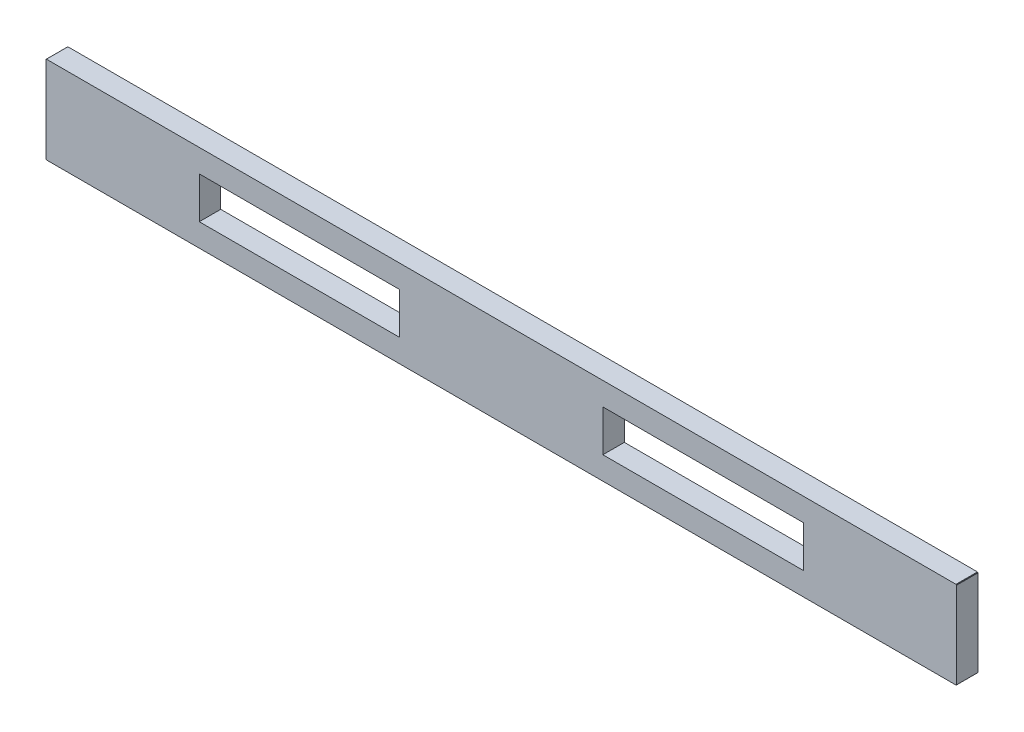
ISO-10303-21;
HEADER;
FILE_DESCRIPTION(('STEP AP214'),'2;1');
FILE_NAME('part.step','',(''),(''),'','','');
FILE_SCHEMA(('AUTOMOTIVE_DESIGN { 1 0 10303 214 1 1 1 1 }'));
ENDSEC;
DATA;
#1=APPLICATION_CONTEXT('core data for automotive mechanical design processes');
#2=APPLICATION_PROTOCOL_DEFINITION('international standard','automotive_design',2000,#1);
#3=PRODUCT_CONTEXT('',#1,'mechanical');
#4=PRODUCT('Part','Part','',(#3));
#5=PRODUCT_RELATED_PRODUCT_CATEGORY('part','',(#4));
#6=PRODUCT_DEFINITION_FORMATION('','',#4);
#7=PRODUCT_DEFINITION_CONTEXT('part definition',#1,'design');
#8=PRODUCT_DEFINITION('design','',#6,#7);
#9=PRODUCT_DEFINITION_SHAPE('','',#8);
#10=(LENGTH_UNIT() NAMED_UNIT(*) SI_UNIT(.MILLI.,.METRE.));
#11=(NAMED_UNIT(*) PLANE_ANGLE_UNIT() SI_UNIT($,.RADIAN.));
#12=(NAMED_UNIT(*) SI_UNIT($,.STERADIAN.) SOLID_ANGLE_UNIT());
#13=UNCERTAINTY_MEASURE_WITH_UNIT(LENGTH_MEASURE(1.E-05),#10,'distance_accuracy_value','');
#14=(GEOMETRIC_REPRESENTATION_CONTEXT(3) GLOBAL_UNCERTAINTY_ASSIGNED_CONTEXT((#13)) GLOBAL_UNIT_ASSIGNED_CONTEXT((#10,
#11,#12)) REPRESENTATION_CONTEXT('',''));
#15=CARTESIAN_POINT('',(0.,0.,0.));
#16=DIRECTION('',(0.,0.,1.));
#17=DIRECTION('',(1.,0.,0.));
#18=AXIS2_PLACEMENT_3D('',#15,#16,#17);
#19=CARTESIAN_POINT('',(0.,0.,3.));
#20=DIRECTION('',(0.,0.,1.));
#21=DIRECTION('',(1.,0.,0.));
#22=AXIS2_PLACEMENT_3D('',#19,#20,#21);
#23=PLANE('',#22);
#24=DIRECTION('',(1.,0.,0.));
#25=VECTOR('',#24,1.);
#26=CARTESIAN_POINT('',(421.603180615999,802.882994984314,3.));
#27=LINE('',#26,#25);
#28=CARTESIAN_POINT('',(294.526980615999,802.882994984314,3.));
#29=VERTEX_POINT('',#28);
#30=CARTESIAN_POINT('',(421.628580615999,802.882994984314,3.));
#31=VERTEX_POINT('',#30);
#32=EDGE_CURVE('E275',#29,#31,#27,.T.);
#33=ORIENTED_EDGE('',*,*,#32,.T.);
#34=DIRECTION('',(0.707106781185002,0.707106781188093,0.));
#35=VECTOR('',#34,1.);
#36=CARTESIAN_POINT('',(421.628580615999,802.882994984314,3.));
#37=LINE('',#36,#35);
#38=CARTESIAN_POINT('',(421.653980615999,802.908394984315,3.));
#39=VERTEX_POINT('',#38);
#40=EDGE_CURVE('E278',#31,#39,#37,.T.);
#41=ORIENTED_EDGE('',*,*,#40,.T.);
#42=DIRECTION('',(0.,1.,0.));
#43=VECTOR('',#42,1.);
#44=CARTESIAN_POINT('',(421.653980615999,802.908394984315,3.));
#45=LINE('',#44,#43);
#46=CARTESIAN_POINT('',(421.653980615999,802.933794984314,3.));
#47=VERTEX_POINT('',#46);
#48=EDGE_CURVE('E281',#39,#47,#45,.T.);
#49=ORIENTED_EDGE('',*,*,#48,.T.);
#50=DIRECTION('',(0.707106781181139,0.707106781191956,0.));
#51=VECTOR('',#50,1.);
#52=CARTESIAN_POINT('',(421.653980615999,802.933794984314,3.));
#53=LINE('',#52,#51);
#54=CARTESIAN_POINT('',(421.679380615999,802.959194984314,3.));
#55=VERTEX_POINT('',#54);
#56=EDGE_CURVE('E283',#47,#55,#53,.T.);
#57=ORIENTED_EDGE('',*,*,#56,.T.);
#58=DIRECTION('',(0.,1.,0.));
#59=VECTOR('',#58,1.);
#60=CARTESIAN_POINT('',(421.679380615999,802.959194984314,3.));
#61=LINE('',#60,#59);
#62=CARTESIAN_POINT('',(421.679380615999,814.998794984315,3.));
#63=VERTEX_POINT('',#62);
#64=EDGE_CURVE('E285',#55,#63,#61,.T.);
#65=ORIENTED_EDGE('',*,*,#64,.T.);
#66=DIRECTION('',(-0.70710678118732,0.707106781185775,0.));
#67=VECTOR('',#66,1.);
#68=CARTESIAN_POINT('',(421.679380615999,814.998794984315,3.));
#69=LINE('',#68,#67);
#70=CARTESIAN_POINT('',(421.653980615999,815.024194984314,3.));
#71=VERTEX_POINT('',#70);
#72=EDGE_CURVE('E287',#63,#71,#69,.T.);
#73=ORIENTED_EDGE('',*,*,#72,.T.);
#74=DIRECTION('',(0.,1.,0.));
#75=VECTOR('',#74,1.);
#76=CARTESIAN_POINT('',(421.653980615999,815.024194984314,3.));
#77=LINE('',#76,#75);
#78=CARTESIAN_POINT('',(421.653980615999,815.049594984314,3.));
#79=VERTEX_POINT('',#78);
#80=EDGE_CURVE('E289',#71,#79,#77,.T.);
#81=ORIENTED_EDGE('',*,*,#80,.T.);
#82=DIRECTION('',(-1.,0.,0.));
#83=VECTOR('',#82,1.);
#84=CARTESIAN_POINT('',(421.653980615999,815.049594984314,3.));
#85=LINE('',#84,#83);
#86=CARTESIAN_POINT('',(421.628580615999,815.049594984314,3.));
#87=VERTEX_POINT('',#86);
#88=EDGE_CURVE('E291',#79,#87,#85,.T.);
#89=ORIENTED_EDGE('',*,*,#88,.T.);
#90=DIRECTION('',(-0.707106781188093,0.707106781185002,0.));
#91=VECTOR('',#90,1.);
#92=CARTESIAN_POINT('',(421.628580615999,815.049594984314,3.));
#93=LINE('',#92,#91);
#94=CARTESIAN_POINT('',(421.603180615999,815.074994984315,3.));
#95=VERTEX_POINT('',#94);
#96=EDGE_CURVE('E293',#87,#95,#93,.T.);
#97=ORIENTED_EDGE('',*,*,#96,.T.);
#98=DIRECTION('',(-1.,0.,0.));
#99=VECTOR('',#98,1.);
#100=CARTESIAN_POINT('',(421.603180615999,815.074994984315,3.));
#101=LINE('',#100,#99);
#102=CARTESIAN_POINT('',(294.552380615999,815.074994984315,3.));
#103=VERTEX_POINT('',#102);
#104=EDGE_CURVE('E295',#95,#103,#101,.T.);
#105=ORIENTED_EDGE('',*,*,#104,.T.);
#106=DIRECTION('',(-0.707106781184229,-0.707106781188865,0.));
#107=VECTOR('',#106,1.);
#108=CARTESIAN_POINT('',(294.552380615999,815.074994984315,3.));
#109=LINE('',#108,#107);
#110=CARTESIAN_POINT('',(294.526980615999,815.049594984314,3.));
#111=VERTEX_POINT('',#110);
#112=EDGE_CURVE('E297',#103,#111,#109,.T.);
#113=ORIENTED_EDGE('',*,*,#112,.T.);
#114=DIRECTION('',(-1.,0.,0.));
#115=VECTOR('',#114,1.);
#116=CARTESIAN_POINT('',(294.526980615999,815.049594984314,3.));
#117=LINE('',#116,#115);
#118=CARTESIAN_POINT('',(294.501580615999,815.049594984314,3.));
#119=VERTEX_POINT('',#118);
#120=EDGE_CURVE('E299',#111,#119,#117,.T.);
#121=ORIENTED_EDGE('',*,*,#120,.T.);
#122=DIRECTION('',(0.,-1.,0.));
#123=VECTOR('',#122,1.);
#124=CARTESIAN_POINT('',(294.501580615999,815.049594984314,3.));
#125=LINE('',#124,#123);
#126=CARTESIAN_POINT('',(294.501580615999,815.024194984314,3.));
#127=VERTEX_POINT('',#126);
#128=EDGE_CURVE('E301',#119,#127,#125,.T.);
#129=ORIENTED_EDGE('',*,*,#128,.T.);
#130=DIRECTION('',(-0.707106781188865,-0.707106781184229,0.));
#131=VECTOR('',#130,1.);
#132=CARTESIAN_POINT('',(294.501580615999,815.024194984314,3.));
#133=LINE('',#132,#131);
#134=CARTESIAN_POINT('',(294.476180615999,814.998794984315,3.));
#135=VERTEX_POINT('',#134);
#136=EDGE_CURVE('E303',#127,#135,#133,.T.);
#137=ORIENTED_EDGE('',*,*,#136,.T.);
#138=DIRECTION('',(0.,-1.,0.));
#139=VECTOR('',#138,1.);
#140=CARTESIAN_POINT('',(294.476180615999,814.998794984315,3.));
#141=LINE('',#140,#139);
#142=CARTESIAN_POINT('',(294.476180615999,802.959194984314,3.));
#143=VERTEX_POINT('',#142);
#144=EDGE_CURVE('E305',#135,#143,#141,.T.);
#145=ORIENTED_EDGE('',*,*,#144,.T.);
#146=DIRECTION('',(0.447213595501522,-0.894427190999134,0.));
#147=VECTOR('',#146,1.);
#148=CARTESIAN_POINT('',(294.476180615999,802.959194984314,3.));
#149=LINE('',#148,#147);
#150=CARTESIAN_POINT('',(294.501580615999,802.908394984315,3.));
#151=VERTEX_POINT('',#150);
#152=EDGE_CURVE('E307',#143,#151,#149,.T.);
#153=ORIENTED_EDGE('',*,*,#152,.T.);
#154=DIRECTION('',(0.707106781180366,-0.707106781192729,0.));
#155=VECTOR('',#154,1.);
#156=CARTESIAN_POINT('',(294.501580615999,802.908394984315,3.));
#157=LINE('',#156,#155);
#158=EDGE_CURVE('E309',#151,#29,#157,.T.);
#159=ORIENTED_EDGE('',*,*,#158,.T.);
#160=EDGE_LOOP('',(#33,#41,#49,#57,#65,#73,#81,#89,#97,#105,#113,#121,#129,#137,#145,#153,#159));
#161=FACE_BOUND('',#160,.T.);
#162=DIRECTION('',(0.,1.,0.));
#163=VECTOR('',#162,1.);
#164=CARTESIAN_POINT('',(400.267180615999,806.083394984315,3.));
#165=LINE('',#164,#163);
#166=CARTESIAN_POINT('',(400.267180615999,806.083394984315,3.));
#167=VERTEX_POINT('',#166);
#168=CARTESIAN_POINT('',(400.267180615999,811.874594984315,3.));
#169=VERTEX_POINT('',#168);
#170=EDGE_CURVE('E246',#167,#169,#165,.T.);
#171=ORIENTED_EDGE('',*,*,#170,.F.);
#172=DIRECTION('',(1.,0.,0.));
#173=VECTOR('',#172,1.);
#174=CARTESIAN_POINT('',(372.276380615999,806.083394984315,3.));
#175=LINE('',#174,#173);
#176=CARTESIAN_POINT('',(372.276380615999,806.083394984315,3.));
#177=VERTEX_POINT('',#176);
#178=EDGE_CURVE('E244',#177,#167,#175,.T.);
#179=ORIENTED_EDGE('',*,*,#178,.F.);
#180=DIRECTION('',(0.,-1.,0.));
#181=VECTOR('',#180,1.);
#182=CARTESIAN_POINT('',(372.276380615999,811.874594984315,3.));
#183=LINE('',#182,#181);
#184=CARTESIAN_POINT('',(372.276380615999,811.874594984315,3.));
#185=VERTEX_POINT('',#184);
#186=EDGE_CURVE('E252',#185,#177,#183,.T.);
#187=ORIENTED_EDGE('',*,*,#186,.F.);
#188=DIRECTION('',(-1.,0.,0.));
#189=VECTOR('',#188,1.);
#190=CARTESIAN_POINT('',(400.267180615999,811.874594984315,3.));
#191=LINE('',#190,#189);
#192=EDGE_CURVE('E249',#169,#185,#191,.T.);
#193=ORIENTED_EDGE('',*,*,#192,.F.);
#194=EDGE_LOOP('',(#171,#179,#187,#193));
#195=FACE_BOUND('',#194,.T.);
#196=DIRECTION('',(0.,1.,0.));
#197=VECTOR('',#196,1.);
#198=CARTESIAN_POINT('',(343.879180615999,806.083394984315,3.));
#199=LINE('',#198,#197);
#200=CARTESIAN_POINT('',(343.879180615999,806.083394984315,3.));
#201=VERTEX_POINT('',#200);
#202=CARTESIAN_POINT('',(343.879180615999,811.874594984315,3.));
#203=VERTEX_POINT('',#202);
#204=EDGE_CURVE('E216',#201,#203,#199,.T.);
#205=ORIENTED_EDGE('',*,*,#204,.F.);
#206=DIRECTION('',(1.,0.,0.));
#207=VECTOR('',#206,1.);
#208=CARTESIAN_POINT('',(315.888380615999,806.083394984315,3.));
#209=LINE('',#208,#207);
#210=CARTESIAN_POINT('',(315.888380615999,806.083394984315,3.));
#211=VERTEX_POINT('',#210);
#212=EDGE_CURVE('E208',#211,#201,#209,.T.);
#213=ORIENTED_EDGE('',*,*,#212,.F.);
#214=DIRECTION('',(0.,-1.,0.));
#215=VECTOR('',#214,1.);
#216=CARTESIAN_POINT('',(315.888380615999,811.874594984315,3.));
#217=LINE('',#216,#215);
#218=CARTESIAN_POINT('',(315.888380615999,811.874594984315,3.));
#219=VERTEX_POINT('',#218);
#220=EDGE_CURVE('E230',#219,#211,#217,.T.);
#221=ORIENTED_EDGE('',*,*,#220,.F.);
#222=DIRECTION('',(-1.,0.,0.));
#223=VECTOR('',#222,1.);
#224=CARTESIAN_POINT('',(343.879180615999,811.874594984315,3.));
#225=LINE('',#224,#223);
#226=EDGE_CURVE('E228',#203,#219,#225,.T.);
#227=ORIENTED_EDGE('',*,*,#226,.F.);
#228=EDGE_LOOP('',(#205,#213,#221,#227));
#229=FACE_BOUND('',#228,.T.);
#230=ADVANCED_FACE('F41',(#161,#195,#229),#23,.T.);
#231=CARTESIAN_POINT('',(0.,0.,0.));
#232=DIRECTION('',(0.,0.,1.));
#233=DIRECTION('',(1.,0.,0.));
#234=AXIS2_PLACEMENT_3D('',#231,#232,#233);
#235=PLANE('',#234);
#236=DIRECTION('',(1.,0.,0.));
#237=VECTOR('',#236,1.);
#238=CARTESIAN_POINT('',(372.276380615999,806.083394984315,0.));
#239=LINE('',#238,#237);
#240=CARTESIAN_POINT('',(372.276380615999,806.083394984315,0.));
#241=VERTEX_POINT('',#240);
#242=CARTESIAN_POINT('',(400.267180615999,806.083394984315,0.));
#243=VERTEX_POINT('',#242);
#244=EDGE_CURVE('E224',#241,#243,#239,.T.);
#245=ORIENTED_EDGE('',*,*,#244,.T.);
#246=DIRECTION('',(0.,1.,0.));
#247=VECTOR('',#246,1.);
#248=CARTESIAN_POINT('',(400.267180615999,806.083394984315,0.));
#249=LINE('',#248,#247);
#250=CARTESIAN_POINT('',(400.267180615999,811.874594984315,0.));
#251=VERTEX_POINT('',#250);
#252=EDGE_CURVE('E257',#243,#251,#249,.T.);
#253=ORIENTED_EDGE('',*,*,#252,.T.);
#254=DIRECTION('',(-1.,0.,0.));
#255=VECTOR('',#254,1.);
#256=CARTESIAN_POINT('',(400.267180615999,811.874594984315,0.));
#257=LINE('',#256,#255);
#258=CARTESIAN_POINT('',(372.276380615999,811.874594984315,0.));
#259=VERTEX_POINT('',#258);
#260=EDGE_CURVE('E260',#251,#259,#257,.T.);
#261=ORIENTED_EDGE('',*,*,#260,.T.);
#262=DIRECTION('',(0.,-1.,0.));
#263=VECTOR('',#262,1.);
#264=CARTESIAN_POINT('',(372.276380615999,811.874594984315,0.));
#265=LINE('',#264,#263);
#266=EDGE_CURVE('E247',#259,#241,#265,.T.);
#267=ORIENTED_EDGE('',*,*,#266,.T.);
#268=EDGE_LOOP('',(#245,#253,#261,#267));
#269=FACE_BOUND('',#268,.T.);
#270=DIRECTION('',(0.707106781185002,0.707106781188093,0.));
#271=VECTOR('',#270,1.);
#272=CARTESIAN_POINT('',(421.628580615999,802.882994984314,0.));
#273=LINE('',#272,#271);
#274=CARTESIAN_POINT('',(421.628580615999,802.882994984314,0.));
#275=VERTEX_POINT('',#274);
#276=CARTESIAN_POINT('',(421.653980615999,802.908394984315,0.));
#277=VERTEX_POINT('',#276);
#278=EDGE_CURVE('E274',#275,#277,#273,.T.);
#279=ORIENTED_EDGE('',*,*,#278,.F.);
#280=DIRECTION('',(1.,0.,0.));
#281=VECTOR('',#280,1.);
#282=CARTESIAN_POINT('',(421.603180615999,802.882994984314,0.));
#283=LINE('',#282,#281);
#284=CARTESIAN_POINT('',(294.526980615999,802.882994984314,0.));
#285=VERTEX_POINT('',#284);
#286=EDGE_CURVE('E279',#285,#275,#283,.T.);
#287=ORIENTED_EDGE('',*,*,#286,.F.);
#288=DIRECTION('',(0.707106781180366,-0.707106781192729,0.));
#289=VECTOR('',#288,1.);
#290=CARTESIAN_POINT('',(294.501580615999,802.908394984315,0.));
#291=LINE('',#290,#289);
#292=CARTESIAN_POINT('',(294.501580615999,802.908394984315,0.));
#293=VERTEX_POINT('',#292);
#294=EDGE_CURVE('E342',#293,#285,#291,.T.);
#295=ORIENTED_EDGE('',*,*,#294,.F.);
#296=DIRECTION('',(0.447213595501522,-0.894427190999134,0.));
#297=VECTOR('',#296,1.);
#298=CARTESIAN_POINT('',(294.476180615999,802.959194984314,0.));
#299=LINE('',#298,#297);
#300=CARTESIAN_POINT('',(294.476180615999,802.959194984314,0.));
#301=VERTEX_POINT('',#300);
#302=EDGE_CURVE('E340',#301,#293,#299,.T.);
#303=ORIENTED_EDGE('',*,*,#302,.F.);
#304=DIRECTION('',(0.,-1.,0.));
#305=VECTOR('',#304,1.);
#306=CARTESIAN_POINT('',(294.476180615999,814.998794984315,0.));
#307=LINE('',#306,#305);
#308=CARTESIAN_POINT('',(294.476180615999,814.998794984315,0.));
#309=VERTEX_POINT('',#308);
#310=EDGE_CURVE('E338',#309,#301,#307,.T.);
#311=ORIENTED_EDGE('',*,*,#310,.F.);
#312=DIRECTION('',(-0.707106781188865,-0.707106781184229,0.));
#313=VECTOR('',#312,1.);
#314=CARTESIAN_POINT('',(294.501580615999,815.024194984314,0.));
#315=LINE('',#314,#313);
#316=CARTESIAN_POINT('',(294.501580615999,815.024194984314,0.));
#317=VERTEX_POINT('',#316);
#318=EDGE_CURVE('E336',#317,#309,#315,.T.);
#319=ORIENTED_EDGE('',*,*,#318,.F.);
#320=DIRECTION('',(0.,-1.,0.));
#321=VECTOR('',#320,1.);
#322=CARTESIAN_POINT('',(294.501580615999,815.049594984314,0.));
#323=LINE('',#322,#321);
#324=CARTESIAN_POINT('',(294.501580615999,815.049594984314,0.));
#325=VERTEX_POINT('',#324);
#326=EDGE_CURVE('E334',#325,#317,#323,.T.);
#327=ORIENTED_EDGE('',*,*,#326,.F.);
#328=DIRECTION('',(-1.,0.,0.));
#329=VECTOR('',#328,1.);
#330=CARTESIAN_POINT('',(294.526980615999,815.049594984314,0.));
#331=LINE('',#330,#329);
#332=CARTESIAN_POINT('',(294.526980615999,815.049594984314,0.));
#333=VERTEX_POINT('',#332);
#334=EDGE_CURVE('E332',#333,#325,#331,.T.);
#335=ORIENTED_EDGE('',*,*,#334,.F.);
#336=DIRECTION('',(-0.707106781184229,-0.707106781188865,0.));
#337=VECTOR('',#336,1.);
#338=CARTESIAN_POINT('',(294.552380615999,815.074994984315,0.));
#339=LINE('',#338,#337);
#340=CARTESIAN_POINT('',(294.552380615999,815.074994984315,0.));
#341=VERTEX_POINT('',#340);
#342=EDGE_CURVE('E330',#341,#333,#339,.T.);
#343=ORIENTED_EDGE('',*,*,#342,.F.);
#344=DIRECTION('',(-1.,0.,0.));
#345=VECTOR('',#344,1.);
#346=CARTESIAN_POINT('',(421.603180615999,815.074994984315,0.));
#347=LINE('',#346,#345);
#348=CARTESIAN_POINT('',(421.603180615999,815.074994984315,0.));
#349=VERTEX_POINT('',#348);
#350=EDGE_CURVE('E328',#349,#341,#347,.T.);
#351=ORIENTED_EDGE('',*,*,#350,.F.);
#352=DIRECTION('',(-0.707106781188093,0.707106781185002,0.));
#353=VECTOR('',#352,1.);
#354=CARTESIAN_POINT('',(421.628580615999,815.049594984314,0.));
#355=LINE('',#354,#353);
#356=CARTESIAN_POINT('',(421.628580615999,815.049594984314,0.));
#357=VERTEX_POINT('',#356);
#358=EDGE_CURVE('E326',#357,#349,#355,.T.);
#359=ORIENTED_EDGE('',*,*,#358,.F.);
#360=DIRECTION('',(-1.,0.,0.));
#361=VECTOR('',#360,1.);
#362=CARTESIAN_POINT('',(421.653980615999,815.049594984314,0.));
#363=LINE('',#362,#361);
#364=CARTESIAN_POINT('',(421.653980615999,815.049594984314,0.));
#365=VERTEX_POINT('',#364);
#366=EDGE_CURVE('E324',#365,#357,#363,.T.);
#367=ORIENTED_EDGE('',*,*,#366,.F.);
#368=DIRECTION('',(0.,1.,0.));
#369=VECTOR('',#368,1.);
#370=CARTESIAN_POINT('',(421.653980615999,815.024194984314,0.));
#371=LINE('',#370,#369);
#372=CARTESIAN_POINT('',(421.653980615999,815.024194984314,0.));
#373=VERTEX_POINT('',#372);
#374=EDGE_CURVE('E322',#373,#365,#371,.T.);
#375=ORIENTED_EDGE('',*,*,#374,.F.);
#376=DIRECTION('',(-0.70710678118732,0.707106781185775,0.));
#377=VECTOR('',#376,1.);
#378=CARTESIAN_POINT('',(421.679380615999,814.998794984315,0.));
#379=LINE('',#378,#377);
#380=CARTESIAN_POINT('',(421.679380615999,814.998794984315,0.));
#381=VERTEX_POINT('',#380);
#382=EDGE_CURVE('E320',#381,#373,#379,.T.);
#383=ORIENTED_EDGE('',*,*,#382,.F.);
#384=DIRECTION('',(0.,1.,0.));
#385=VECTOR('',#384,1.);
#386=CARTESIAN_POINT('',(421.679380615999,802.959194984314,0.));
#387=LINE('',#386,#385);
#388=CARTESIAN_POINT('',(421.679380615999,802.959194984314,0.));
#389=VERTEX_POINT('',#388);
#390=EDGE_CURVE('E318',#389,#381,#387,.T.);
#391=ORIENTED_EDGE('',*,*,#390,.F.);
#392=DIRECTION('',(0.707106781181139,0.707106781191956,0.));
#393=VECTOR('',#392,1.);
#394=CARTESIAN_POINT('',(421.653980615999,802.933794984314,0.));
#395=LINE('',#394,#393);
#396=CARTESIAN_POINT('',(421.653980615999,802.933794984314,0.));
#397=VERTEX_POINT('',#396);
#398=EDGE_CURVE('E316',#397,#389,#395,.T.);
#399=ORIENTED_EDGE('',*,*,#398,.F.);
#400=DIRECTION('',(0.,1.,0.));
#401=VECTOR('',#400,1.);
#402=CARTESIAN_POINT('',(421.653980615999,802.908394984315,0.));
#403=LINE('',#402,#401);
#404=EDGE_CURVE('E314',#277,#397,#403,.T.);
#405=ORIENTED_EDGE('',*,*,#404,.F.);
#406=EDGE_LOOP('',(#279,#287,#295,#303,#311,#319,#327,#335,#343,#351,#359,#367,#375,#383,#391,
#399,#405));
#407=FACE_BOUND('',#406,.T.);
#408=DIRECTION('',(1.,0.,0.));
#409=VECTOR('',#408,1.);
#410=CARTESIAN_POINT('',(315.888380615999,806.083394984315,0.));
#411=LINE('',#410,#409);
#412=CARTESIAN_POINT('',(315.888380615999,806.083394984315,0.));
#413=VERTEX_POINT('',#412);
#414=CARTESIAN_POINT('',(343.879180615999,806.083394984315,0.));
#415=VERTEX_POINT('',#414);
#416=EDGE_CURVE('E64',#413,#415,#411,.T.);
#417=ORIENTED_EDGE('',*,*,#416,.T.);
#418=DIRECTION('',(0.,1.,0.));
#419=VECTOR('',#418,1.);
#420=CARTESIAN_POINT('',(343.879180615999,806.083394984315,0.));
#421=LINE('',#420,#419);
#422=CARTESIAN_POINT('',(343.879180615999,811.874594984315,0.));
#423=VERTEX_POINT('',#422);
#424=EDGE_CURVE('E223',#415,#423,#421,.T.);
#425=ORIENTED_EDGE('',*,*,#424,.T.);
#426=DIRECTION('',(-1.,0.,0.));
#427=VECTOR('',#426,1.);
#428=CARTESIAN_POINT('',(343.879180615999,811.874594984315,0.));
#429=LINE('',#428,#427);
#430=CARTESIAN_POINT('',(315.888380615999,811.874594984315,0.));
#431=VERTEX_POINT('',#430);
#432=EDGE_CURVE('E236',#423,#431,#429,.T.);
#433=ORIENTED_EDGE('',*,*,#432,.T.);
#434=DIRECTION('',(0.,-1.,0.));
#435=VECTOR('',#434,1.);
#436=CARTESIAN_POINT('',(315.888380615999,811.874594984315,0.));
#437=LINE('',#436,#435);
#438=EDGE_CURVE('E217',#431,#413,#437,.T.);
#439=ORIENTED_EDGE('',*,*,#438,.T.);
#440=EDGE_LOOP('',(#417,#425,#433,#439));
#441=FACE_BOUND('',#440,.T.);
#442=ADVANCED_FACE('F400',(#269,#407,#441),#235,.F.);
#443=CARTESIAN_POINT('',(421.628580615999,802.882994984314,3.));
#444=DIRECTION('',(-0.707106781188093,0.707106781185002,0.));
#445=DIRECTION('',(-0.707106781185002,-0.707106781188093,0.));
#446=AXIS2_PLACEMENT_3D('',#443,#444,#445);
#447=PLANE('',#446);
#448=ORIENTED_EDGE('',*,*,#278,.T.);
#449=DIRECTION('',(0.,0.,-1.));
#450=VECTOR('',#449,1.);
#451=CARTESIAN_POINT('',(421.653980615999,802.908394984315,3.));
#452=LINE('',#451,#450);
#453=EDGE_CURVE('E49',#39,#277,#452,.T.);
#454=ORIENTED_EDGE('',*,*,#453,.F.);
#455=ORIENTED_EDGE('',*,*,#40,.F.);
#456=DIRECTION('',(0.,0.,-1.));
#457=VECTOR('',#456,1.);
#458=CARTESIAN_POINT('',(421.628580615999,802.882994984314,3.));
#459=LINE('',#458,#457);
#460=EDGE_CURVE('E11',#31,#275,#459,.T.);
#461=ORIENTED_EDGE('',*,*,#460,.T.);
#462=EDGE_LOOP('',(#448,#454,#455,#461));
#463=FACE_BOUND('',#462,.T.);
#464=ADVANCED_FACE('F43',(#463),#447,.F.);
#465=CARTESIAN_POINT('',(421.653980615999,802.908394984315,3.));
#466=DIRECTION('',(-1.,0.,0.));
#467=DIRECTION('',(0.,0.,1.));
#468=AXIS2_PLACEMENT_3D('',#465,#466,#467);
#469=PLANE('',#468);
#470=ORIENTED_EDGE('',*,*,#404,.T.);
#471=DIRECTION('',(0.,0.,-1.));
#472=VECTOR('',#471,1.);
#473=CARTESIAN_POINT('',(421.653980615999,802.933794984314,3.));
#474=LINE('',#473,#472);
#475=EDGE_CURVE('E387',#47,#397,#474,.T.);
#476=ORIENTED_EDGE('',*,*,#475,.F.);
#477=ORIENTED_EDGE('',*,*,#48,.F.);
#478=ORIENTED_EDGE('',*,*,#453,.T.);
#479=EDGE_LOOP('',(#470,#476,#477,#478));
#480=FACE_BOUND('',#479,.T.);
#481=ADVANCED_FACE('F394',(#480),#469,.F.);
#482=CARTESIAN_POINT('',(421.653980615999,802.933794984314,3.));
#483=DIRECTION('',(-0.707106781191956,0.707106781181139,0.));
#484=DIRECTION('',(-0.707106781181139,-0.707106781191956,0.));
#485=AXIS2_PLACEMENT_3D('',#482,#483,#484);
#486=PLANE('',#485);
#487=ORIENTED_EDGE('',*,*,#398,.T.);
#488=DIRECTION('',(0.,0.,-1.));
#489=VECTOR('',#488,1.);
#490=CARTESIAN_POINT('',(421.679380615999,802.959194984314,3.));
#491=LINE('',#490,#489);
#492=EDGE_CURVE('E384',#55,#389,#491,.T.);
#493=ORIENTED_EDGE('',*,*,#492,.F.);
#494=ORIENTED_EDGE('',*,*,#56,.F.);
#495=ORIENTED_EDGE('',*,*,#475,.T.);
#496=EDGE_LOOP('',(#487,#493,#494,#495));
#497=FACE_BOUND('',#496,.T.);
#498=ADVANCED_FACE('F406',(#497),#486,.F.);
#499=CARTESIAN_POINT('',(421.679380615999,802.959194984314,3.));
#500=DIRECTION('',(-1.,0.,0.));
#501=DIRECTION('',(0.,0.,1.));
#502=AXIS2_PLACEMENT_3D('',#499,#500,#501);
#503=PLANE('',#502);
#504=ORIENTED_EDGE('',*,*,#390,.T.);
#505=DIRECTION('',(0.,0.,-1.));
#506=VECTOR('',#505,1.);
#507=CARTESIAN_POINT('',(421.679380615999,814.998794984315,3.));
#508=LINE('',#507,#506);
#509=EDGE_CURVE('E381',#63,#381,#508,.T.);
#510=ORIENTED_EDGE('',*,*,#509,.F.);
#511=ORIENTED_EDGE('',*,*,#64,.F.);
#512=ORIENTED_EDGE('',*,*,#492,.T.);
#513=EDGE_LOOP('',(#504,#510,#511,#512));
#514=FACE_BOUND('',#513,.T.);
#515=ADVANCED_FACE('F410',(#514),#503,.F.);
#516=CARTESIAN_POINT('',(421.679380615999,814.998794984315,3.));
#517=DIRECTION('',(-0.707106781185775,-0.70710678118732,0.));
#518=DIRECTION('',(0.70710678118732,-0.707106781185775,0.));
#519=AXIS2_PLACEMENT_3D('',#516,#517,#518);
#520=PLANE('',#519);
#521=ORIENTED_EDGE('',*,*,#382,.T.);
#522=DIRECTION('',(0.,0.,-1.));
#523=VECTOR('',#522,1.);
#524=CARTESIAN_POINT('',(421.653980615999,815.024194984314,3.));
#525=LINE('',#524,#523);
#526=EDGE_CURVE('E378',#71,#373,#525,.T.);
#527=ORIENTED_EDGE('',*,*,#526,.F.);
#528=ORIENTED_EDGE('',*,*,#72,.F.);
#529=ORIENTED_EDGE('',*,*,#509,.T.);
#530=EDGE_LOOP('',(#521,#527,#528,#529));
#531=FACE_BOUND('',#530,.T.);
#532=ADVANCED_FACE('F475',(#531),#520,.F.);
#533=CARTESIAN_POINT('',(421.653980615999,815.024194984314,3.));
#534=DIRECTION('',(-1.,0.,0.));
#535=DIRECTION('',(0.,0.,1.));
#536=AXIS2_PLACEMENT_3D('',#533,#534,#535);
#537=PLANE('',#536);
#538=ORIENTED_EDGE('',*,*,#374,.T.);
#539=DIRECTION('',(0.,0.,-1.));
#540=VECTOR('',#539,1.);
#541=CARTESIAN_POINT('',(421.653980615999,815.049594984314,3.));
#542=LINE('',#541,#540);
#543=EDGE_CURVE('E375',#79,#365,#542,.T.);
#544=ORIENTED_EDGE('',*,*,#543,.F.);
#545=ORIENTED_EDGE('',*,*,#80,.F.);
#546=ORIENTED_EDGE('',*,*,#526,.T.);
#547=EDGE_LOOP('',(#538,#544,#545,#546));
#548=FACE_BOUND('',#547,.T.);
#549=ADVANCED_FACE('F473',(#548),#537,.F.);
#550=CARTESIAN_POINT('',(421.653980615999,815.049594984314,3.));
#551=DIRECTION('',(0.,-1.,0.));
#552=DIRECTION('',(0.,0.,-1.));
#553=AXIS2_PLACEMENT_3D('',#550,#551,#552);
#554=PLANE('',#553);
#555=ORIENTED_EDGE('',*,*,#366,.T.);
#556=DIRECTION('',(0.,0.,-1.));
#557=VECTOR('',#556,1.);
#558=CARTESIAN_POINT('',(421.628580615999,815.049594984314,3.));
#559=LINE('',#558,#557);
#560=EDGE_CURVE('E372',#87,#357,#559,.T.);
#561=ORIENTED_EDGE('',*,*,#560,.F.);
#562=ORIENTED_EDGE('',*,*,#88,.F.);
#563=ORIENTED_EDGE('',*,*,#543,.T.);
#564=EDGE_LOOP('',(#555,#561,#562,#563));
#565=FACE_BOUND('',#564,.T.);
#566=ADVANCED_FACE('F469',(#565),#554,.F.);
#567=CARTESIAN_POINT('',(421.628580615999,815.049594984314,3.));
#568=DIRECTION('',(-0.707106781185002,-0.707106781188093,0.));
#569=DIRECTION('',(0.707106781188093,-0.707106781185002,0.));
#570=AXIS2_PLACEMENT_3D('',#567,#568,#569);
#571=PLANE('',#570);
#572=ORIENTED_EDGE('',*,*,#358,.T.);
#573=DIRECTION('',(0.,0.,-1.));
#574=VECTOR('',#573,1.);
#575=CARTESIAN_POINT('',(421.603180615999,815.074994984315,3.));
#576=LINE('',#575,#574);
#577=EDGE_CURVE('E369',#95,#349,#576,.T.);
#578=ORIENTED_EDGE('',*,*,#577,.F.);
#579=ORIENTED_EDGE('',*,*,#96,.F.);
#580=ORIENTED_EDGE('',*,*,#560,.T.);
#581=EDGE_LOOP('',(#572,#578,#579,#580));
#582=FACE_BOUND('',#581,.T.);
#583=ADVANCED_FACE('F464',(#582),#571,.F.);
#584=CARTESIAN_POINT('',(421.603180615999,815.074994984315,3.));
#585=DIRECTION('',(0.,-1.,0.));
#586=DIRECTION('',(0.,0.,-1.));
#587=AXIS2_PLACEMENT_3D('',#584,#585,#586);
#588=PLANE('',#587);
#589=ORIENTED_EDGE('',*,*,#350,.T.);
#590=DIRECTION('',(0.,0.,-1.));
#591=VECTOR('',#590,1.);
#592=CARTESIAN_POINT('',(294.552380615999,815.074994984315,3.));
#593=LINE('',#592,#591);
#594=EDGE_CURVE('E366',#103,#341,#593,.T.);
#595=ORIENTED_EDGE('',*,*,#594,.F.);
#596=ORIENTED_EDGE('',*,*,#104,.F.);
#597=ORIENTED_EDGE('',*,*,#577,.T.);
#598=EDGE_LOOP('',(#589,#595,#596,#597));
#599=FACE_BOUND('',#598,.T.);
#600=ADVANCED_FACE('F458',(#599),#588,.F.);
#601=CARTESIAN_POINT('',(294.552380615999,815.074994984315,3.));
#602=DIRECTION('',(0.707106781188866,-0.70710678118423,0.));
#603=DIRECTION('',(0.70710678118423,0.707106781188866,0.));
#604=AXIS2_PLACEMENT_3D('',#601,#602,#603);
#605=PLANE('',#604);
#606=ORIENTED_EDGE('',*,*,#342,.T.);
#607=DIRECTION('',(0.,0.,-1.));
#608=VECTOR('',#607,1.);
#609=CARTESIAN_POINT('',(294.526980615999,815.049594984314,3.));
#610=LINE('',#609,#608);
#611=EDGE_CURVE('E363',#111,#333,#610,.T.);
#612=ORIENTED_EDGE('',*,*,#611,.F.);
#613=ORIENTED_EDGE('',*,*,#112,.F.);
#614=ORIENTED_EDGE('',*,*,#594,.T.);
#615=EDGE_LOOP('',(#606,#612,#613,#614));
#616=FACE_BOUND('',#615,.T.);
#617=ADVANCED_FACE('F454',(#616),#605,.F.);
#618=CARTESIAN_POINT('',(294.526980615999,815.049594984314,3.));
#619=DIRECTION('',(0.,-1.,0.));
#620=DIRECTION('',(0.,0.,-1.));
#621=AXIS2_PLACEMENT_3D('',#618,#619,#620);
#622=PLANE('',#621);
#623=ORIENTED_EDGE('',*,*,#334,.T.);
#624=DIRECTION('',(0.,0.,-1.));
#625=VECTOR('',#624,1.);
#626=CARTESIAN_POINT('',(294.501580615999,815.049594984314,3.));
#627=LINE('',#626,#625);
#628=EDGE_CURVE('E360',#119,#325,#627,.T.);
#629=ORIENTED_EDGE('',*,*,#628,.F.);
#630=ORIENTED_EDGE('',*,*,#120,.F.);
#631=ORIENTED_EDGE('',*,*,#611,.T.);
#632=EDGE_LOOP('',(#623,#629,#630,#631));
#633=FACE_BOUND('',#632,.T.);
#634=ADVANCED_FACE('F449',(#633),#622,.F.);
#635=CARTESIAN_POINT('',(294.501580615999,815.049594984314,3.));
#636=DIRECTION('',(1.,0.,0.));
#637=DIRECTION('',(0.,0.,-1.));
#638=AXIS2_PLACEMENT_3D('',#635,#636,#637);
#639=PLANE('',#638);
#640=ORIENTED_EDGE('',*,*,#326,.T.);
#641=DIRECTION('',(0.,0.,-1.));
#642=VECTOR('',#641,1.);
#643=CARTESIAN_POINT('',(294.501580615999,815.024194984314,3.));
#644=LINE('',#643,#642);
#645=EDGE_CURVE('E357',#127,#317,#644,.T.);
#646=ORIENTED_EDGE('',*,*,#645,.F.);
#647=ORIENTED_EDGE('',*,*,#128,.F.);
#648=ORIENTED_EDGE('',*,*,#628,.T.);
#649=EDGE_LOOP('',(#640,#646,#647,#648));
#650=FACE_BOUND('',#649,.T.);
#651=ADVANCED_FACE('F443',(#650),#639,.F.);
#652=CARTESIAN_POINT('',(294.501580615999,815.024194984314,3.));
#653=DIRECTION('',(0.70710678118423,-0.707106781188866,0.));
#654=DIRECTION('',(0.707106781188866,0.70710678118423,0.));
#655=AXIS2_PLACEMENT_3D('',#652,#653,#654);
#656=PLANE('',#655);
#657=ORIENTED_EDGE('',*,*,#318,.T.);
#658=DIRECTION('',(0.,0.,-1.));
#659=VECTOR('',#658,1.);
#660=CARTESIAN_POINT('',(294.476180615999,814.998794984315,3.));
#661=LINE('',#660,#659);
#662=EDGE_CURVE('E354',#135,#309,#661,.T.);
#663=ORIENTED_EDGE('',*,*,#662,.F.);
#664=ORIENTED_EDGE('',*,*,#136,.F.);
#665=ORIENTED_EDGE('',*,*,#645,.T.);
#666=EDGE_LOOP('',(#657,#663,#664,#665));
#667=FACE_BOUND('',#666,.T.);
#668=ADVANCED_FACE('F439',(#667),#656,.F.);
#669=CARTESIAN_POINT('',(294.476180615999,814.998794984315,3.));
#670=DIRECTION('',(1.,0.,0.));
#671=DIRECTION('',(0.,0.,-1.));
#672=AXIS2_PLACEMENT_3D('',#669,#670,#671);
#673=PLANE('',#672);
#674=ORIENTED_EDGE('',*,*,#310,.T.);
#675=DIRECTION('',(0.,0.,-1.));
#676=VECTOR('',#675,1.);
#677=CARTESIAN_POINT('',(294.476180615999,802.959194984314,3.));
#678=LINE('',#677,#676);
#679=EDGE_CURVE('E351',#143,#301,#678,.T.);
#680=ORIENTED_EDGE('',*,*,#679,.F.);
#681=ORIENTED_EDGE('',*,*,#144,.F.);
#682=ORIENTED_EDGE('',*,*,#662,.T.);
#683=EDGE_LOOP('',(#674,#680,#681,#682));
#684=FACE_BOUND('',#683,.T.);
#685=ADVANCED_FACE('F434',(#684),#673,.F.);
#686=CARTESIAN_POINT('',(294.476180615999,802.959194984314,3.));
#687=DIRECTION('',(0.894427190999134,0.447213595501522,0.));
#688=DIRECTION('',(-0.447213595501522,0.894427190999134,0.));
#689=AXIS2_PLACEMENT_3D('',#686,#687,#688);
#690=PLANE('',#689);
#691=ORIENTED_EDGE('',*,*,#302,.T.);
#692=DIRECTION('',(0.,0.,-1.));
#693=VECTOR('',#692,1.);
#694=CARTESIAN_POINT('',(294.501580615999,802.908394984315,3.));
#695=LINE('',#694,#693);
#696=EDGE_CURVE('E348',#151,#293,#695,.T.);
#697=ORIENTED_EDGE('',*,*,#696,.F.);
#698=ORIENTED_EDGE('',*,*,#152,.F.);
#699=ORIENTED_EDGE('',*,*,#679,.T.);
#700=EDGE_LOOP('',(#691,#697,#698,#699));
#701=FACE_BOUND('',#700,.T.);
#702=ADVANCED_FACE('F428',(#701),#690,.F.);
#703=CARTESIAN_POINT('',(294.501580615999,802.908394984315,3.));
#704=DIRECTION('',(0.707106781192729,0.707106781180366,0.));
#705=DIRECTION('',(-0.707106781180366,0.707106781192729,0.));
#706=AXIS2_PLACEMENT_3D('',#703,#704,#705);
#707=PLANE('',#706);
#708=ORIENTED_EDGE('',*,*,#294,.T.);
#709=DIRECTION('',(0.,0.,-1.));
#710=VECTOR('',#709,1.);
#711=CARTESIAN_POINT('',(294.526980615999,802.882994984314,3.));
#712=LINE('',#711,#710);
#713=EDGE_CURVE('E312',#29,#285,#712,.T.);
#714=ORIENTED_EDGE('',*,*,#713,.F.);
#715=ORIENTED_EDGE('',*,*,#158,.F.);
#716=ORIENTED_EDGE('',*,*,#696,.T.);
#717=EDGE_LOOP('',(#708,#714,#715,#716));
#718=FACE_BOUND('',#717,.T.);
#719=ADVANCED_FACE('F423',(#718),#707,.F.);
#720=CARTESIAN_POINT('',(421.603180615999,802.882994984314,3.));
#721=DIRECTION('',(0.,1.,0.));
#722=DIRECTION('',(0.,0.,1.));
#723=AXIS2_PLACEMENT_3D('',#720,#721,#722);
#724=PLANE('',#723);
#725=ORIENTED_EDGE('',*,*,#286,.T.);
#726=ORIENTED_EDGE('',*,*,#460,.F.);
#727=ORIENTED_EDGE('',*,*,#32,.F.);
#728=ORIENTED_EDGE('',*,*,#713,.T.);
#729=EDGE_LOOP('',(#725,#726,#727,#728));
#730=FACE_BOUND('',#729,.T.);
#731=ADVANCED_FACE('F418',(#730),#724,.F.);
#732=CARTESIAN_POINT('',(372.276380615999,806.083394984315,3.));
#733=DIRECTION('',(0.,1.,0.));
#734=DIRECTION('',(0.,0.,1.));
#735=AXIS2_PLACEMENT_3D('',#732,#733,#734);
#736=PLANE('',#735);
#737=ORIENTED_EDGE('',*,*,#244,.F.);
#738=DIRECTION('',(0.,0.,-1.));
#739=VECTOR('',#738,1.);
#740=CARTESIAN_POINT('',(372.276380615999,806.083394984315,3.));
#741=LINE('',#740,#739);
#742=EDGE_CURVE('E254',#177,#241,#741,.T.);
#743=ORIENTED_EDGE('',*,*,#742,.F.);
#744=ORIENTED_EDGE('',*,*,#178,.T.);
#745=DIRECTION('',(0.,0.,-1.));
#746=VECTOR('',#745,1.);
#747=CARTESIAN_POINT('',(400.267180615999,806.083394984315,3.));
#748=LINE('',#747,#746);
#749=EDGE_CURVE('E271',#167,#243,#748,.T.);
#750=ORIENTED_EDGE('',*,*,#749,.T.);
#751=EDGE_LOOP('',(#737,#743,#744,#750));
#752=FACE_BOUND('',#751,.T.);
#753=ADVANCED_FACE('F494',(#752),#736,.T.);
#754=CARTESIAN_POINT('',(400.267180615999,806.083394984315,3.));
#755=DIRECTION('',(-1.,0.,0.));
#756=DIRECTION('',(0.,0.,1.));
#757=AXIS2_PLACEMENT_3D('',#754,#755,#756);
#758=PLANE('',#757);
#759=ORIENTED_EDGE('',*,*,#252,.F.);
#760=ORIENTED_EDGE('',*,*,#749,.F.);
#761=ORIENTED_EDGE('',*,*,#170,.T.);
#762=DIRECTION('',(0.,0.,-1.));
#763=VECTOR('',#762,1.);
#764=CARTESIAN_POINT('',(400.267180615999,811.874594984315,3.));
#765=LINE('',#764,#763);
#766=EDGE_CURVE('E269',#169,#251,#765,.T.);
#767=ORIENTED_EDGE('',*,*,#766,.T.);
#768=EDGE_LOOP('',(#759,#760,#761,#767));
#769=FACE_BOUND('',#768,.T.);
#770=ADVANCED_FACE('F588',(#769),#758,.T.);
#771=CARTESIAN_POINT('',(400.267180615999,811.874594984315,3.));
#772=DIRECTION('',(0.,-1.,0.));
#773=DIRECTION('',(0.,0.,-1.));
#774=AXIS2_PLACEMENT_3D('',#771,#772,#773);
#775=PLANE('',#774);
#776=ORIENTED_EDGE('',*,*,#260,.F.);
#777=ORIENTED_EDGE('',*,*,#766,.F.);
#778=ORIENTED_EDGE('',*,*,#192,.T.);
#779=DIRECTION('',(0.,0.,-1.));
#780=VECTOR('',#779,1.);
#781=CARTESIAN_POINT('',(372.276380615999,811.874594984315,3.));
#782=LINE('',#781,#780);
#783=EDGE_CURVE('E267',#185,#259,#782,.T.);
#784=ORIENTED_EDGE('',*,*,#783,.T.);
#785=EDGE_LOOP('',(#776,#777,#778,#784));
#786=FACE_BOUND('',#785,.T.);
#787=ADVANCED_FACE('F596',(#786),#775,.T.);
#788=CARTESIAN_POINT('',(372.276380615999,811.874594984315,3.));
#789=DIRECTION('',(1.,0.,0.));
#790=DIRECTION('',(0.,0.,-1.));
#791=AXIS2_PLACEMENT_3D('',#788,#789,#790);
#792=PLANE('',#791);
#793=ORIENTED_EDGE('',*,*,#266,.F.);
#794=ORIENTED_EDGE('',*,*,#783,.F.);
#795=ORIENTED_EDGE('',*,*,#186,.T.);
#796=ORIENTED_EDGE('',*,*,#742,.T.);
#797=EDGE_LOOP('',(#793,#794,#795,#796));
#798=FACE_BOUND('',#797,.T.);
#799=ADVANCED_FACE('F604',(#798),#792,.T.);
#800=CARTESIAN_POINT('',(315.888380615999,806.083394984315,3.));
#801=DIRECTION('',(0.,1.,0.));
#802=DIRECTION('',(0.,0.,1.));
#803=AXIS2_PLACEMENT_3D('',#800,#801,#802);
#804=PLANE('',#803);
#805=ORIENTED_EDGE('',*,*,#416,.F.);
#806=DIRECTION('',(0.,0.,-1.));
#807=VECTOR('',#806,1.);
#808=CARTESIAN_POINT('',(315.888380615999,806.083394984315,3.));
#809=LINE('',#808,#807);
#810=EDGE_CURVE('E212',#211,#413,#809,.T.);
#811=ORIENTED_EDGE('',*,*,#810,.F.);
#812=ORIENTED_EDGE('',*,*,#212,.T.);
#813=DIRECTION('',(0.,0.,-1.));
#814=VECTOR('',#813,1.);
#815=CARTESIAN_POINT('',(343.879180615999,806.083394984315,3.));
#816=LINE('',#815,#814);
#817=EDGE_CURVE('E211',#201,#415,#816,.T.);
#818=ORIENTED_EDGE('',*,*,#817,.T.);
#819=EDGE_LOOP('',(#805,#811,#812,#818));
#820=FACE_BOUND('',#819,.T.);
#821=ADVANCED_FACE('F210',(#820),#804,.T.);
#822=CARTESIAN_POINT('',(343.879180615999,806.083394984315,3.));
#823=DIRECTION('',(-1.,0.,0.));
#824=DIRECTION('',(0.,0.,1.));
#825=AXIS2_PLACEMENT_3D('',#822,#823,#824);
#826=PLANE('',#825);
#827=ORIENTED_EDGE('',*,*,#424,.F.);
#828=ORIENTED_EDGE('',*,*,#817,.F.);
#829=ORIENTED_EDGE('',*,*,#204,.T.);
#830=DIRECTION('',(0.,0.,-1.));
#831=VECTOR('',#830,1.);
#832=CARTESIAN_POINT('',(343.879180615999,811.874594984315,3.));
#833=LINE('',#832,#831);
#834=EDGE_CURVE('E225',#203,#423,#833,.T.);
#835=ORIENTED_EDGE('',*,*,#834,.T.);
#836=EDGE_LOOP('',(#827,#828,#829,#835));
#837=FACE_BOUND('',#836,.T.);
#838=ADVANCED_FACE('F220',(#837),#826,.T.);
#839=CARTESIAN_POINT('',(343.879180615999,811.874594984315,3.));
#840=DIRECTION('',(0.,-1.,0.));
#841=DIRECTION('',(0.,0.,-1.));
#842=AXIS2_PLACEMENT_3D('',#839,#840,#841);
#843=PLANE('',#842);
#844=ORIENTED_EDGE('',*,*,#432,.F.);
#845=ORIENTED_EDGE('',*,*,#834,.F.);
#846=ORIENTED_EDGE('',*,*,#226,.T.);
#847=DIRECTION('',(0.,0.,-1.));
#848=VECTOR('',#847,1.);
#849=CARTESIAN_POINT('',(315.888380615999,811.874594984315,3.));
#850=LINE('',#849,#848);
#851=EDGE_CURVE('E56',#219,#431,#850,.T.);
#852=ORIENTED_EDGE('',*,*,#851,.T.);
#853=EDGE_LOOP('',(#844,#845,#846,#852));
#854=FACE_BOUND('',#853,.T.);
#855=ADVANCED_FACE('F628',(#854),#843,.T.);
#856=CARTESIAN_POINT('',(315.888380615999,811.874594984315,3.));
#857=DIRECTION('',(1.,0.,0.));
#858=DIRECTION('',(0.,0.,-1.));
#859=AXIS2_PLACEMENT_3D('',#856,#857,#858);
#860=PLANE('',#859);
#861=ORIENTED_EDGE('',*,*,#438,.F.);
#862=ORIENTED_EDGE('',*,*,#851,.F.);
#863=ORIENTED_EDGE('',*,*,#220,.T.);
#864=ORIENTED_EDGE('',*,*,#810,.T.);
#865=EDGE_LOOP('',(#861,#862,#863,#864));
#866=FACE_BOUND('',#865,.T.);
#867=ADVANCED_FACE('F636',(#866),#860,.T.);
#868=CLOSED_SHELL('',(#230,#442,#464,#481,#498,#515,#532,#549,#566,#583,#600,#617,#634,#651,
#668,#685,#702,#719,#731,#753,#770,#787,#799,#821,#838,#855,#867));
#869=MANIFOLD_SOLID_BREP('B2',#868);
#870=ADVANCED_BREP_SHAPE_REPRESENTATION('',(#18,#869),#14);
#871=SHAPE_DEFINITION_REPRESENTATION(#9,#870);
ENDSEC;
END-ISO-10303-21;
